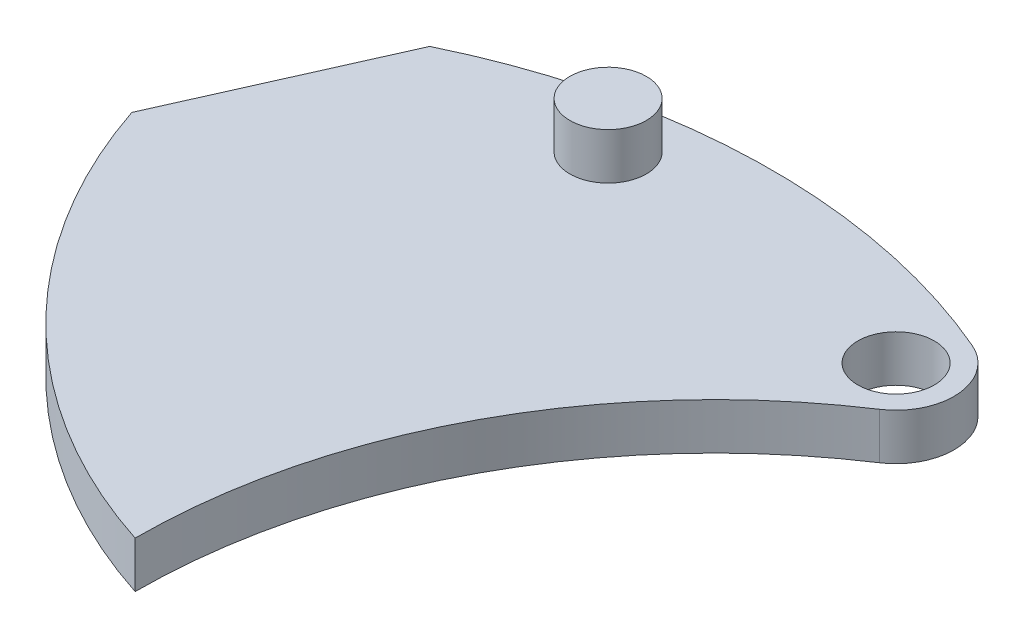
ISO-10303-21;
HEADER;
FILE_DESCRIPTION(('STEP AP214'),'2;1');
FILE_NAME('part.step','',(''),(''),'','','');
FILE_SCHEMA(('AUTOMOTIVE_DESIGN { 1 0 10303 214 1 1 1 1 }'));
ENDSEC;
DATA;
#1=APPLICATION_CONTEXT('core data for automotive mechanical design processes');
#2=APPLICATION_PROTOCOL_DEFINITION('international standard','automotive_design',2000,#1);
#3=PRODUCT_CONTEXT('',#1,'mechanical');
#4=PRODUCT('Part','Part','',(#3));
#5=PRODUCT_RELATED_PRODUCT_CATEGORY('part','',(#4));
#6=PRODUCT_DEFINITION_FORMATION('','',#4);
#7=PRODUCT_DEFINITION_CONTEXT('part definition',#1,'design');
#8=PRODUCT_DEFINITION('design','',#6,#7);
#9=PRODUCT_DEFINITION_SHAPE('','',#8);
#10=(LENGTH_UNIT() NAMED_UNIT(*) SI_UNIT(.MILLI.,.METRE.));
#11=(NAMED_UNIT(*) PLANE_ANGLE_UNIT() SI_UNIT($,.RADIAN.));
#12=(NAMED_UNIT(*) SI_UNIT($,.STERADIAN.) SOLID_ANGLE_UNIT());
#13=UNCERTAINTY_MEASURE_WITH_UNIT(LENGTH_MEASURE(1.E-05),#10,'distance_accuracy_value','');
#14=(GEOMETRIC_REPRESENTATION_CONTEXT(3) GLOBAL_UNCERTAINTY_ASSIGNED_CONTEXT((#13)) GLOBAL_UNIT_ASSIGNED_CONTEXT((#10,
#11,#12)) REPRESENTATION_CONTEXT('',''));
#15=CARTESIAN_POINT('',(0.,0.,0.));
#16=DIRECTION('',(0.,0.,1.));
#17=DIRECTION('',(1.,0.,0.));
#18=AXIS2_PLACEMENT_3D('',#15,#16,#17);
#19=CARTESIAN_POINT('',(-4.22686810681053,4.,-24.6400808847623));
#20=DIRECTION('',(0.,-1.,0.));
#21=DIRECTION('',(0.,0.,-1.));
#22=AXIS2_PLACEMENT_3D('',#19,#20,#21);
#23=CYLINDRICAL_SURFACE('',#22,1.65);
#24=CARTESIAN_POINT('',(-4.22686810681053,4.,-24.6400808847623));
#25=DIRECTION('',(0.,-1.,0.));
#26=DIRECTION('',(0.,0.,-1.));
#27=AXIS2_PLACEMENT_3D('',#24,#25,#26);
#28=CIRCLE('',#27,1.65);
#29=CARTESIAN_POINT('',(-4.22686810681053,4.,-26.2900808847623));
#30=VERTEX_POINT('',#29);
#31=EDGE_CURVE('E11',#30,#30,#28,.T.);
#32=ORIENTED_EDGE('',*,*,#31,.T.);
#33=EDGE_LOOP('',(#32));
#34=FACE_BOUND('',#33,.T.);
#35=CARTESIAN_POINT('',(-4.22686810681053,0.,-24.6400808847623));
#36=DIRECTION('',(0.,-1.,0.));
#37=DIRECTION('',(0.,0.,-1.));
#38=AXIS2_PLACEMENT_3D('',#35,#36,#37);
#39=CIRCLE('',#38,1.65);
#40=CARTESIAN_POINT('',(-4.22686810681053,0.,-26.2900808847623));
#41=VERTEX_POINT('',#40);
#42=EDGE_CURVE('E44',#41,#41,#39,.T.);
#43=ORIENTED_EDGE('',*,*,#42,.F.);
#44=EDGE_LOOP('',(#43));
#45=FACE_BOUND('',#44,.T.);
#46=ADVANCED_FACE('F41',(#34,#45),#23,.T.);
#47=CARTESIAN_POINT('',(-4.22686810681053,4.,-24.6400808847623));
#48=DIRECTION('',(0.,-1.,0.));
#49=DIRECTION('',(0.,0.,-1.));
#50=AXIS2_PLACEMENT_3D('',#47,#48,#49);
#51=PLANE('',#50);
#52=ORIENTED_EDGE('',*,*,#31,.F.);
#53=EDGE_LOOP('',(#52));
#54=FACE_BOUND('',#53,.T.);
#55=ADVANCED_FACE('F56',(#54),#51,.F.);
#56=CARTESIAN_POINT('',(-4.22686810681053,0.,-24.6400808847623));
#57=DIRECTION('',(0.,-1.,0.));
#58=DIRECTION('',(0.,0.,-1.));
#59=AXIS2_PLACEMENT_3D('',#56,#57,#58);
#60=PLANE('',#59);
#61=ORIENTED_EDGE('',*,*,#42,.T.);
#62=EDGE_LOOP('',(#61));
#63=FACE_BOUND('',#62,.T.);
#64=ADVANCED_FACE('F53',(#63),#60,.T.);
#65=CLOSED_SHELL('',(#46,#55,#64));
#66=MANIFOLD_SOLID_BREP('B2',#65);
#67=CARTESIAN_POINT('',(7.72542485937361,2.,-23.7764129073789));
#68=DIRECTION('',(0.,-1.,0.));
#69=DIRECTION('',(0.,0.,-1.));
#70=AXIS2_PLACEMENT_3D('',#67,#68,#69);
#71=CYLINDRICAL_SURFACE('',#70,25.);
#72=DIRECTION('',(0.,1.,0.));
#73=VECTOR('',#72,1.);
#74=CARTESIAN_POINT('',(-15.9809170269938,-0.00100000000000013,-15.8385697263465));
#75=LINE('',#74,#73);
#76=CARTESIAN_POINT('',(-15.9809170269938,0.,-15.8385697263465));
#77=VERTEX_POINT('',#76);
#78=CARTESIAN_POINT('',(-15.9809170269938,2.,-15.8385697263465));
#79=VERTEX_POINT('',#78);
#80=EDGE_CURVE('E129',#77,#79,#75,.T.);
#81=ORIENTED_EDGE('',*,*,#80,.F.);
#82=CARTESIAN_POINT('',(7.72542485937361,0.,-23.7764129073789));
#83=DIRECTION('',(0.,1.,0.));
#84=DIRECTION('',(0.,0.,1.));
#85=AXIS2_PLACEMENT_3D('',#82,#83,#84);
#86=CIRCLE('',#85,25.);
#87=CARTESIAN_POINT('',(0.,0.,0.));
#88=VERTEX_POINT('',#87);
#89=EDGE_CURVE('E157',#77,#88,#86,.T.);
#90=ORIENTED_EDGE('',*,*,#89,.T.);
#91=DIRECTION('',(0.,-1.,0.));
#92=VECTOR('',#91,1.);
#93=CARTESIAN_POINT('',(0.,2.,0.));
#94=LINE('',#93,#92);
#95=CARTESIAN_POINT('',(0.,2.,0.));
#96=VERTEX_POINT('',#95);
#97=EDGE_CURVE('E147',#96,#88,#94,.T.);
#98=ORIENTED_EDGE('',*,*,#97,.F.);
#99=CARTESIAN_POINT('',(7.72542485937361,2.,-23.7764129073789));
#100=DIRECTION('',(0.,1.,0.));
#101=DIRECTION('',(0.,0.,1.));
#102=AXIS2_PLACEMENT_3D('',#99,#100,#101);
#103=CIRCLE('',#102,25.);
#104=EDGE_CURVE('E153',#79,#96,#103,.T.);
#105=ORIENTED_EDGE('',*,*,#104,.F.);
#106=EDGE_LOOP('',(#81,#90,#98,#105));
#107=FACE_BOUND('',#106,.T.);
#108=ADVANCED_FACE('F81',(#107),#71,.T.);
#109=CARTESIAN_POINT('',(0.,2.,0.));
#110=DIRECTION('',(0.,-1.,0.));
#111=DIRECTION('',(0.,0.,-1.));
#112=AXIS2_PLACEMENT_3D('',#109,#110,#111);
#113=CYLINDRICAL_SURFACE('',#112,27.5);
#114=DIRECTION('',(0.,1.,0.));
#115=VECTOR('',#114,1.);
#116=CARTESIAN_POINT('',(-12.0207457016555,-0.00100000000000013,-24.7336142279314));
#117=LINE('',#116,#115);
#118=CARTESIAN_POINT('',(-12.0207457016555,0.,-24.7336142279314));
#119=VERTEX_POINT('',#118);
#120=CARTESIAN_POINT('',(-12.0207457016555,2.,-24.7336142279314));
#121=VERTEX_POINT('',#120);
#122=EDGE_CURVE('E96',#119,#121,#117,.T.);
#123=ORIENTED_EDGE('',*,*,#122,.T.);
#124=CARTESIAN_POINT('',(0.,2.,0.));
#125=DIRECTION('',(0.,1.,0.));
#126=DIRECTION('',(0.,0.,1.));
#127=AXIS2_PLACEMENT_3D('',#124,#125,#126);
#128=CIRCLE('',#127,27.5);
#129=CARTESIAN_POINT('',(10.8625,2.,-25.2637307963412));
#130=VERTEX_POINT('',#129);
#131=EDGE_CURVE('E140',#130,#121,#128,.T.);
#132=ORIENTED_EDGE('',*,*,#131,.F.);
#133=DIRECTION('',(0.,-1.,0.));
#134=VECTOR('',#133,1.);
#135=CARTESIAN_POINT('',(10.8625,2.,-25.2637307963412));
#136=LINE('',#135,#134);
#137=CARTESIAN_POINT('',(10.8625,0.,-25.2637307963412));
#138=VERTEX_POINT('',#137);
#139=EDGE_CURVE('E151',#130,#138,#136,.T.);
#140=ORIENTED_EDGE('',*,*,#139,.T.);
#141=CARTESIAN_POINT('',(0.,0.,0.));
#142=DIRECTION('',(0.,1.,0.));
#143=DIRECTION('',(0.,0.,1.));
#144=AXIS2_PLACEMENT_3D('',#141,#142,#143);
#145=CIRCLE('',#144,27.5);
#146=EDGE_CURVE('E143',#138,#119,#145,.T.);
#147=ORIENTED_EDGE('',*,*,#146,.T.);
#148=EDGE_LOOP('',(#123,#132,#140,#147));
#149=FACE_BOUND('',#148,.T.);
#150=ADVANCED_FACE('F138',(#149),#113,.T.);
#151=CARTESIAN_POINT('',(16.3627124296868,2.,-11.8882064536894));
#152=DIRECTION('',(0.,1.,0.));
#153=DIRECTION('',(0.,0.,1.));
#154=AXIS2_PLACEMENT_3D('',#151,#152,#153);
#155=PLANE('',#154);
#156=CARTESIAN_POINT('',(-4.22686810681053,2.,-24.6400808847623));
#157=DIRECTION('',(0.,1.,0.));
#158=DIRECTION('',(0.,0.,1.));
#159=AXIS2_PLACEMENT_3D('',#156,#157,#158);
#160=CIRCLE('',#159,1.65);
#161=CARTESIAN_POINT('',(-4.22686810681053,2.,-22.9900808847623));
#162=VERTEX_POINT('',#161);
#163=EDGE_CURVE('E254',#162,#162,#160,.T.);
#164=ORIENTED_EDGE('',*,*,#163,.F.);
#165=EDGE_LOOP('',(#164));
#166=FACE_BOUND('',#165,.T.);
#167=CARTESIAN_POINT('',(9.87500000000001,2.,-22.9670279966738));
#168=DIRECTION('',(0.,1.,0.));
#169=DIRECTION('',(0.,0.,1.));
#170=AXIS2_PLACEMENT_3D('',#167,#168,#169);
#171=CIRCLE('',#170,1.65);
#172=CARTESIAN_POINT('',(9.87500000000001,2.,-21.3170279966738));
#173=VERTEX_POINT('',#172);
#174=EDGE_CURVE('E259',#173,#173,#171,.T.);
#175=ORIENTED_EDGE('',*,*,#174,.F.);
#176=EDGE_LOOP('',(#175));
#177=FACE_BOUND('',#176,.T.);
#178=ORIENTED_EDGE('',*,*,#131,.T.);
#179=DIRECTION('',(-0.406723130948702,0.,0.913551473509449));
#180=VECTOR('',#179,1.);
#181=CARTESIAN_POINT('',(-19.2223133299624,2.,-8.55798462193427));
#182=LINE('',#181,#180);
#183=EDGE_CURVE('E126',#121,#79,#182,.T.);
#184=ORIENTED_EDGE('',*,*,#183,.T.);
#185=ORIENTED_EDGE('',*,*,#104,.T.);
#186=CARTESIAN_POINT('',(25.,2.,0.));
#187=DIRECTION('',(0.,-1.,0.));
#188=DIRECTION('',(0.,0.,1.));
#189=AXIS2_PLACEMENT_3D('',#186,#187,#188);
#190=CIRCLE('',#189,25.);
#191=CARTESIAN_POINT('',(11.25,2.,-20.8791163606126));
#192=VERTEX_POINT('',#191);
#193=EDGE_CURVE('E148',#96,#192,#190,.T.);
#194=ORIENTED_EDGE('',*,*,#193,.T.);
#195=CARTESIAN_POINT('',(9.87500000000001,2.,-22.9670279966738));
#196=DIRECTION('',(0.,1.,0.));
#197=DIRECTION('',(0.,0.,1.));
#198=AXIS2_PLACEMENT_3D('',#195,#196,#197);
#199=CIRCLE('',#198,2.5);
#200=EDGE_CURVE('E39',#192,#130,#199,.T.);
#201=ORIENTED_EDGE('',*,*,#200,.T.);
#202=EDGE_LOOP('',(#178,#184,#185,#194,#201));
#203=FACE_BOUND('',#202,.T.);
#204=ADVANCED_FACE('F145',(#166,#177,#203),#155,.T.);
#205=CARTESIAN_POINT('',(16.3627124296868,0.,-11.8882064536894));
#206=DIRECTION('',(0.,1.,0.));
#207=DIRECTION('',(0.,0.,1.));
#208=AXIS2_PLACEMENT_3D('',#205,#206,#207);
#209=PLANE('',#208);
#210=CARTESIAN_POINT('',(9.87500000000001,0.,-22.9670279966738));
#211=DIRECTION('',(0.,1.,0.));
#212=DIRECTION('',(0.,0.,1.));
#213=AXIS2_PLACEMENT_3D('',#210,#211,#212);
#214=CIRCLE('',#213,1.65);
#215=CARTESIAN_POINT('',(9.87500000000001,0.,-21.3170279966738));
#216=VERTEX_POINT('',#215);
#217=EDGE_CURVE('E255',#216,#216,#214,.T.);
#218=ORIENTED_EDGE('',*,*,#217,.T.);
#219=EDGE_LOOP('',(#218));
#220=FACE_BOUND('',#219,.T.);
#221=CARTESIAN_POINT('',(-4.22686810681053,0.,-24.6400808847623));
#222=DIRECTION('',(0.,1.,0.));
#223=DIRECTION('',(0.,0.,1.));
#224=AXIS2_PLACEMENT_3D('',#221,#222,#223);
#225=CIRCLE('',#224,1.65);
#226=CARTESIAN_POINT('',(-4.22686810681053,0.,-22.9900808847623));
#227=VERTEX_POINT('',#226);
#228=EDGE_CURVE('E160',#227,#227,#225,.T.);
#229=ORIENTED_EDGE('',*,*,#228,.T.);
#230=EDGE_LOOP('',(#229));
#231=FACE_BOUND('',#230,.T.);
#232=DIRECTION('',(0.406723130948702,0.,-0.913551473509449));
#233=VECTOR('',#232,1.);
#234=CARTESIAN_POINT('',(-19.2223133299624,0.,-8.55798462193427));
#235=LINE('',#234,#233);
#236=EDGE_CURVE('E133',#77,#119,#235,.T.);
#237=ORIENTED_EDGE('',*,*,#236,.T.);
#238=ORIENTED_EDGE('',*,*,#146,.F.);
#239=CARTESIAN_POINT('',(9.87500000000001,0.,-22.9670279966738));
#240=DIRECTION('',(0.,1.,0.));
#241=DIRECTION('',(0.,0.,1.));
#242=AXIS2_PLACEMENT_3D('',#239,#240,#241);
#243=CIRCLE('',#242,2.5);
#244=CARTESIAN_POINT('',(11.25,0.,-20.8791163606126));
#245=VERTEX_POINT('',#244);
#246=EDGE_CURVE('E164',#138,#245,#243,.F.);
#247=ORIENTED_EDGE('',*,*,#246,.T.);
#248=CARTESIAN_POINT('',(25.,0.,0.));
#249=DIRECTION('',(0.,-1.,0.));
#250=DIRECTION('',(0.,0.,1.));
#251=AXIS2_PLACEMENT_3D('',#248,#249,#250);
#252=CIRCLE('',#251,25.);
#253=EDGE_CURVE('E159',#88,#245,#252,.T.);
#254=ORIENTED_EDGE('',*,*,#253,.F.);
#255=ORIENTED_EDGE('',*,*,#89,.F.);
#256=EDGE_LOOP('',(#237,#238,#247,#254,#255));
#257=FACE_BOUND('',#256,.T.);
#258=ADVANCED_FACE('F167',(#220,#231,#257),#209,.F.);
#259=CARTESIAN_POINT('',(25.,2.,0.));
#260=DIRECTION('',(0.,-1.,0.));
#261=DIRECTION('',(0.,0.,-1.));
#262=AXIS2_PLACEMENT_3D('',#259,#260,#261);
#263=CYLINDRICAL_SURFACE('',#262,25.);
#264=ORIENTED_EDGE('',*,*,#253,.T.);
#265=DIRECTION('',(0.,-1.,0.));
#266=VECTOR('',#265,1.);
#267=CARTESIAN_POINT('',(11.25,2.,-20.8791163606126));
#268=LINE('',#267,#266);
#269=EDGE_CURVE('E89',#245,#192,#268,.F.);
#270=ORIENTED_EDGE('',*,*,#269,.T.);
#271=ORIENTED_EDGE('',*,*,#193,.F.);
#272=ORIENTED_EDGE('',*,*,#97,.T.);
#273=EDGE_LOOP('',(#264,#270,#271,#272));
#274=FACE_BOUND('',#273,.T.);
#275=ADVANCED_FACE('F170',(#274),#263,.F.);
#276=CARTESIAN_POINT('',(9.87500000000001,2.,-22.9670279966738));
#277=DIRECTION('',(0.,1.,0.));
#278=DIRECTION('',(0.,0.,1.));
#279=AXIS2_PLACEMENT_3D('',#276,#277,#278);
#280=CYLINDRICAL_SURFACE('',#279,2.5);
#281=ORIENTED_EDGE('',*,*,#200,.F.);
#282=ORIENTED_EDGE('',*,*,#269,.F.);
#283=ORIENTED_EDGE('',*,*,#246,.F.);
#284=ORIENTED_EDGE('',*,*,#139,.F.);
#285=EDGE_LOOP('',(#281,#282,#283,#284));
#286=FACE_BOUND('',#285,.T.);
#287=ADVANCED_FACE('F83',(#286),#280,.T.);
#288=CARTESIAN_POINT('',(9.87500000000001,0.,-22.9670279966738));
#289=DIRECTION('',(0.,1.,0.));
#290=DIRECTION('',(0.,0.,1.));
#291=AXIS2_PLACEMENT_3D('',#288,#289,#290);
#292=CYLINDRICAL_SURFACE('',#291,1.65);
#293=ORIENTED_EDGE('',*,*,#217,.F.);
#294=EDGE_LOOP('',(#293));
#295=FACE_BOUND('',#294,.T.);
#296=ORIENTED_EDGE('',*,*,#174,.T.);
#297=EDGE_LOOP('',(#296));
#298=FACE_BOUND('',#297,.T.);
#299=ADVANCED_FACE('F173',(#295,#298),#292,.F.);
#300=CARTESIAN_POINT('',(-4.22686810681053,0.,-24.6400808847623));
#301=DIRECTION('',(0.,1.,0.));
#302=DIRECTION('',(0.,0.,1.));
#303=AXIS2_PLACEMENT_3D('',#300,#301,#302);
#304=CYLINDRICAL_SURFACE('',#303,1.65);
#305=ORIENTED_EDGE('',*,*,#228,.F.);
#306=EDGE_LOOP('',(#305));
#307=FACE_BOUND('',#306,.T.);
#308=ORIENTED_EDGE('',*,*,#163,.T.);
#309=EDGE_LOOP('',(#308));
#310=FACE_BOUND('',#309,.T.);
#311=ADVANCED_FACE('F178',(#307,#310),#304,.F.);
#312=CARTESIAN_POINT('',(-19.2223133299624,-0.00100000000000013,-8.55798462193427));
#313=DIRECTION('',(-0.913551473509449,0.,-0.406723130948702));
#314=DIRECTION('',(-0.406723130948702,0.,0.913551473509449));
#315=AXIS2_PLACEMENT_3D('',#312,#313,#314);
#316=PLANE('',#315);
#317=ORIENTED_EDGE('',*,*,#80,.T.);
#318=ORIENTED_EDGE('',*,*,#183,.F.);
#319=ORIENTED_EDGE('',*,*,#122,.F.);
#320=ORIENTED_EDGE('',*,*,#236,.F.);
#321=EDGE_LOOP('',(#317,#318,#319,#320));
#322=FACE_BOUND('',#321,.T.);
#323=ADVANCED_FACE('F127',(#322),#316,.T.);
#324=CLOSED_SHELL('',(#108,#150,#204,#258,#275,#287,#299,#311,#323));
#325=MANIFOLD_SOLID_BREP('B6',#324);
#326=ADVANCED_BREP_SHAPE_REPRESENTATION('',(#18,#66,#325),#14);
#327=SHAPE_DEFINITION_REPRESENTATION(#9,#326);
ENDSEC;
END-ISO-10303-21;
